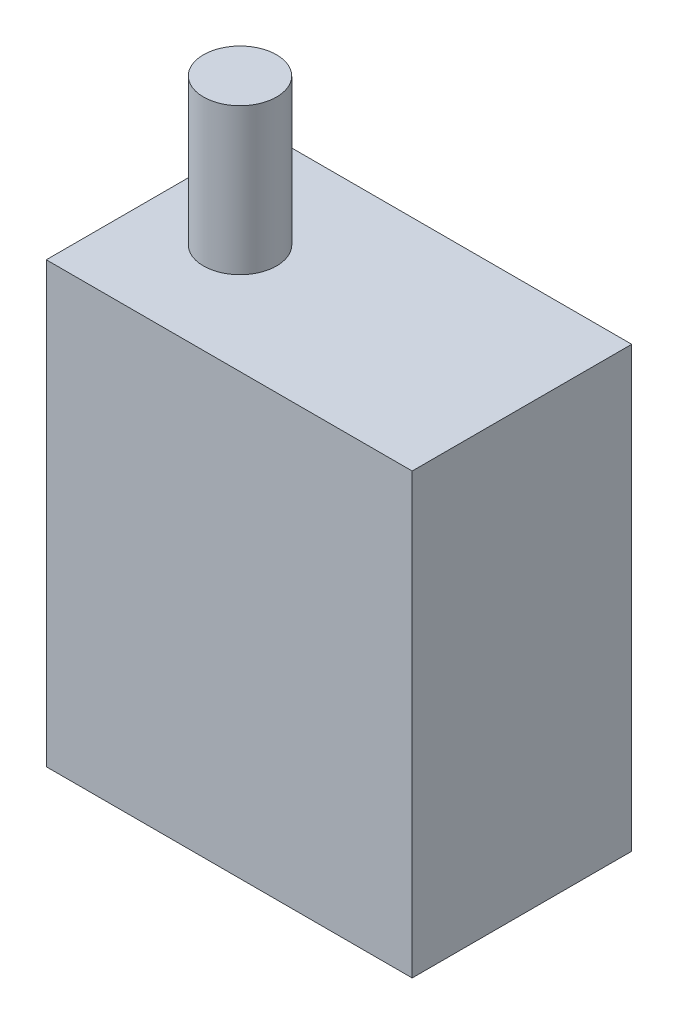
ISO-10303-21;
HEADER;
FILE_DESCRIPTION(('STEP AP214'),'2;1');
FILE_NAME('part.step','',(''),(''),'','','');
FILE_SCHEMA(('AUTOMOTIVE_DESIGN { 1 0 10303 214 1 1 1 1 }'));
ENDSEC;
DATA;
#1=APPLICATION_CONTEXT('core data for automotive mechanical design processes');
#2=APPLICATION_PROTOCOL_DEFINITION('international standard','automotive_design',2000,#1);
#3=PRODUCT_CONTEXT('',#1,'mechanical');
#4=PRODUCT('Part','Part','',(#3));
#5=PRODUCT_RELATED_PRODUCT_CATEGORY('part','',(#4));
#6=PRODUCT_DEFINITION_FORMATION('','',#4);
#7=PRODUCT_DEFINITION_CONTEXT('part definition',#1,'design');
#8=PRODUCT_DEFINITION('design','',#6,#7);
#9=PRODUCT_DEFINITION_SHAPE('','',#8);
#10=(LENGTH_UNIT() NAMED_UNIT(*) SI_UNIT(.MILLI.,.METRE.));
#11=(NAMED_UNIT(*) PLANE_ANGLE_UNIT() SI_UNIT($,.RADIAN.));
#12=(NAMED_UNIT(*) SI_UNIT($,.STERADIAN.) SOLID_ANGLE_UNIT());
#13=UNCERTAINTY_MEASURE_WITH_UNIT(LENGTH_MEASURE(1.E-05),#10,'distance_accuracy_value','');
#14=(GEOMETRIC_REPRESENTATION_CONTEXT(3) GLOBAL_UNCERTAINTY_ASSIGNED_CONTEXT((#13)) GLOBAL_UNIT_ASSIGNED_CONTEXT((#10,
#11,#12)) REPRESENTATION_CONTEXT('',''));
#15=CARTESIAN_POINT('',(0.,0.,0.));
#16=DIRECTION('',(0.,0.,1.));
#17=DIRECTION('',(1.,0.,0.));
#18=AXIS2_PLACEMENT_3D('',#15,#16,#17);
#19=CARTESIAN_POINT('',(0.,30.,0.));
#20=DIRECTION('',(-1.,0.,0.));
#21=DIRECTION('',(0.,0.,1.));
#22=AXIS2_PLACEMENT_3D('',#19,#20,#21);
#23=PLANE('',#22);
#24=DIRECTION('',(0.,0.,-1.));
#25=VECTOR('',#24,1.);
#26=CARTESIAN_POINT('',(0.,0.,0.));
#27=LINE('',#26,#25);
#28=CARTESIAN_POINT('',(0.,0.,0.));
#29=VERTEX_POINT('',#28);
#30=CARTESIAN_POINT('',(0.,0.,-15.));
#31=VERTEX_POINT('',#30);
#32=EDGE_CURVE('E96',#29,#31,#27,.T.);
#33=ORIENTED_EDGE('',*,*,#32,.T.);
#34=DIRECTION('',(0.,-1.,0.));
#35=VECTOR('',#34,1.);
#36=CARTESIAN_POINT('',(0.,30.,-15.));
#37=LINE('',#36,#35);
#38=CARTESIAN_POINT('',(0.,30.,-15.));
#39=VERTEX_POINT('',#38);
#40=EDGE_CURVE('E11',#39,#31,#37,.T.);
#41=ORIENTED_EDGE('',*,*,#40,.F.);
#42=DIRECTION('',(0.,0.,-1.));
#43=VECTOR('',#42,1.);
#44=CARTESIAN_POINT('',(0.,30.,0.));
#45=LINE('',#44,#43);
#46=CARTESIAN_POINT('',(0.,30.,0.));
#47=VERTEX_POINT('',#46);
#48=EDGE_CURVE('E84',#47,#39,#45,.T.);
#49=ORIENTED_EDGE('',*,*,#48,.F.);
#50=DIRECTION('',(0.,-1.,0.));
#51=VECTOR('',#50,1.);
#52=CARTESIAN_POINT('',(0.,30.,0.));
#53=LINE('',#52,#51);
#54=EDGE_CURVE('E92',#47,#29,#53,.T.);
#55=ORIENTED_EDGE('',*,*,#54,.T.);
#56=EDGE_LOOP('',(#33,#41,#49,#55));
#57=FACE_BOUND('',#56,.T.);
#58=ADVANCED_FACE('F33',(#57),#23,.F.);
#59=CARTESIAN_POINT('',(0.,30.,-15.));
#60=DIRECTION('',(0.,0.,1.));
#61=DIRECTION('',(1.,0.,0.));
#62=AXIS2_PLACEMENT_3D('',#59,#60,#61);
#63=PLANE('',#62);
#64=DIRECTION('',(-1.,0.,0.));
#65=VECTOR('',#64,1.);
#66=CARTESIAN_POINT('',(0.,0.,-15.));
#67=LINE('',#66,#65);
#68=CARTESIAN_POINT('',(-25.,0.,-15.));
#69=VERTEX_POINT('',#68);
#70=EDGE_CURVE('E88',#31,#69,#67,.T.);
#71=ORIENTED_EDGE('',*,*,#70,.T.);
#72=DIRECTION('',(0.,-1.,0.));
#73=VECTOR('',#72,1.);
#74=CARTESIAN_POINT('',(-25.,30.,-15.));
#75=LINE('',#74,#73);
#76=CARTESIAN_POINT('',(-25.,30.,-15.));
#77=VERTEX_POINT('',#76);
#78=EDGE_CURVE('E41',#77,#69,#75,.T.);
#79=ORIENTED_EDGE('',*,*,#78,.F.);
#80=DIRECTION('',(-1.,0.,0.));
#81=VECTOR('',#80,1.);
#82=CARTESIAN_POINT('',(0.,30.,-15.));
#83=LINE('',#82,#81);
#84=EDGE_CURVE('E79',#39,#77,#83,.T.);
#85=ORIENTED_EDGE('',*,*,#84,.F.);
#86=ORIENTED_EDGE('',*,*,#40,.T.);
#87=EDGE_LOOP('',(#71,#79,#85,#86));
#88=FACE_BOUND('',#87,.T.);
#89=ADVANCED_FACE('F87',(#88),#63,.F.);
#90=CARTESIAN_POINT('',(-25.,30.,0.));
#91=DIRECTION('',(1.,0.,0.));
#92=DIRECTION('',(0.,0.,-1.));
#93=AXIS2_PLACEMENT_3D('',#90,#91,#92);
#94=PLANE('',#93);
#95=DIRECTION('',(0.,0.,1.));
#96=VECTOR('',#95,1.);
#97=CARTESIAN_POINT('',(-25.,0.,0.));
#98=LINE('',#97,#96);
#99=CARTESIAN_POINT('',(-25.,0.,0.));
#100=VERTEX_POINT('',#99);
#101=EDGE_CURVE('E66',#69,#100,#98,.T.);
#102=ORIENTED_EDGE('',*,*,#101,.T.);
#103=DIRECTION('',(0.,-1.,0.));
#104=VECTOR('',#103,1.);
#105=CARTESIAN_POINT('',(-25.,30.,0.));
#106=LINE('',#105,#104);
#107=CARTESIAN_POINT('',(-25.,30.,0.));
#108=VERTEX_POINT('',#107);
#109=EDGE_CURVE('E89',#108,#100,#106,.T.);
#110=ORIENTED_EDGE('',*,*,#109,.F.);
#111=DIRECTION('',(0.,0.,1.));
#112=VECTOR('',#111,1.);
#113=CARTESIAN_POINT('',(-25.,30.,0.));
#114=LINE('',#113,#112);
#115=EDGE_CURVE('E82',#77,#108,#114,.T.);
#116=ORIENTED_EDGE('',*,*,#115,.F.);
#117=ORIENTED_EDGE('',*,*,#78,.T.);
#118=EDGE_LOOP('',(#102,#110,#116,#117));
#119=FACE_BOUND('',#118,.T.);
#120=ADVANCED_FACE('F90',(#119),#94,.F.);
#121=CARTESIAN_POINT('',(0.,30.,0.));
#122=DIRECTION('',(0.,0.,-1.));
#123=DIRECTION('',(-1.,0.,0.));
#124=AXIS2_PLACEMENT_3D('',#121,#122,#123);
#125=PLANE('',#124);
#126=DIRECTION('',(1.,0.,0.));
#127=VECTOR('',#126,1.);
#128=CARTESIAN_POINT('',(0.,0.,0.));
#129=LINE('',#128,#127);
#130=EDGE_CURVE('E72',#100,#29,#129,.T.);
#131=ORIENTED_EDGE('',*,*,#130,.T.);
#132=ORIENTED_EDGE('',*,*,#54,.F.);
#133=DIRECTION('',(1.,0.,0.));
#134=VECTOR('',#133,1.);
#135=CARTESIAN_POINT('',(0.,30.,0.));
#136=LINE('',#135,#134);
#137=EDGE_CURVE('E49',#108,#47,#136,.T.);
#138=ORIENTED_EDGE('',*,*,#137,.F.);
#139=ORIENTED_EDGE('',*,*,#109,.T.);
#140=EDGE_LOOP('',(#131,#132,#138,#139));
#141=FACE_BOUND('',#140,.T.);
#142=ADVANCED_FACE('F104',(#141),#125,.F.);
#143=CARTESIAN_POINT('',(0.,30.,0.));
#144=DIRECTION('',(0.,1.,0.));
#145=DIRECTION('',(0.,0.,1.));
#146=AXIS2_PLACEMENT_3D('',#143,#144,#145);
#147=PLANE('',#146);
#148=CARTESIAN_POINT('',(-19.2631880924523,30.,-7.50000000000001));
#149=DIRECTION('',(0.,1.,0.));
#150=DIRECTION('',(0.,0.,1.));
#151=AXIS2_PLACEMENT_3D('',#148,#149,#150);
#152=CIRCLE('',#151,2.5);
#153=CARTESIAN_POINT('',(-19.2631880924523,30.,-5.00000000000001));
#154=VERTEX_POINT('',#153);
#155=EDGE_CURVE('E110',#154,#154,#152,.T.);
#156=ORIENTED_EDGE('',*,*,#155,.F.);
#157=EDGE_LOOP('',(#156));
#158=FACE_BOUND('',#157,.T.);
#159=ORIENTED_EDGE('',*,*,#48,.T.);
#160=ORIENTED_EDGE('',*,*,#84,.T.);
#161=ORIENTED_EDGE('',*,*,#115,.T.);
#162=ORIENTED_EDGE('',*,*,#137,.T.);
#163=EDGE_LOOP('',(#159,#160,#161,#162));
#164=FACE_BOUND('',#163,.T.);
#165=ADVANCED_FACE('F80',(#158,#164),#147,.T.);
#166=CARTESIAN_POINT('',(0.,0.,0.));
#167=DIRECTION('',(0.,1.,0.));
#168=DIRECTION('',(0.,0.,1.));
#169=AXIS2_PLACEMENT_3D('',#166,#167,#168);
#170=PLANE('',#169);
#171=ORIENTED_EDGE('',*,*,#32,.F.);
#172=ORIENTED_EDGE('',*,*,#130,.F.);
#173=ORIENTED_EDGE('',*,*,#101,.F.);
#174=ORIENTED_EDGE('',*,*,#70,.F.);
#175=EDGE_LOOP('',(#171,#172,#173,#174));
#176=FACE_BOUND('',#175,.T.);
#177=ADVANCED_FACE('F107',(#176),#170,.F.);
#178=CARTESIAN_POINT('',(-19.2631880924523,40.,-7.50000000000001));
#179=DIRECTION('',(0.,-1.,0.));
#180=DIRECTION('',(0.,0.,-1.));
#181=AXIS2_PLACEMENT_3D('',#178,#179,#180);
#182=CYLINDRICAL_SURFACE('',#181,2.5);
#183=CARTESIAN_POINT('',(-19.2631880924523,40.,-7.50000000000001));
#184=DIRECTION('',(0.,1.,0.));
#185=DIRECTION('',(0.,0.,1.));
#186=AXIS2_PLACEMENT_3D('',#183,#184,#185);
#187=CIRCLE('',#186,2.5);
#188=CARTESIAN_POINT('',(-19.2631880924523,40.,-5.00000000000001));
#189=VERTEX_POINT('',#188);
#190=EDGE_CURVE('E99',#189,#189,#187,.T.);
#191=ORIENTED_EDGE('',*,*,#190,.F.);
#192=EDGE_LOOP('',(#191));
#193=FACE_BOUND('',#192,.T.);
#194=ORIENTED_EDGE('',*,*,#155,.T.);
#195=EDGE_LOOP('',(#194));
#196=FACE_BOUND('',#195,.T.);
#197=ADVANCED_FACE('F118',(#193,#196),#182,.T.);
#198=CARTESIAN_POINT('',(-19.2631880924523,40.,-7.50000000000001));
#199=DIRECTION('',(0.,1.,0.));
#200=DIRECTION('',(0.,0.,1.));
#201=AXIS2_PLACEMENT_3D('',#198,#199,#200);
#202=PLANE('',#201);
#203=ORIENTED_EDGE('',*,*,#190,.T.);
#204=EDGE_LOOP('',(#203));
#205=FACE_BOUND('',#204,.T.);
#206=ADVANCED_FACE('F116',(#205),#202,.T.);
#207=CLOSED_SHELL('',(#58,#89,#120,#142,#165,#177,#197,#206));
#208=MANIFOLD_SOLID_BREP('B2',#207);
#209=ADVANCED_BREP_SHAPE_REPRESENTATION('',(#18,#208),#14);
#210=SHAPE_DEFINITION_REPRESENTATION(#9,#209);
ENDSEC;
END-ISO-10303-21;
